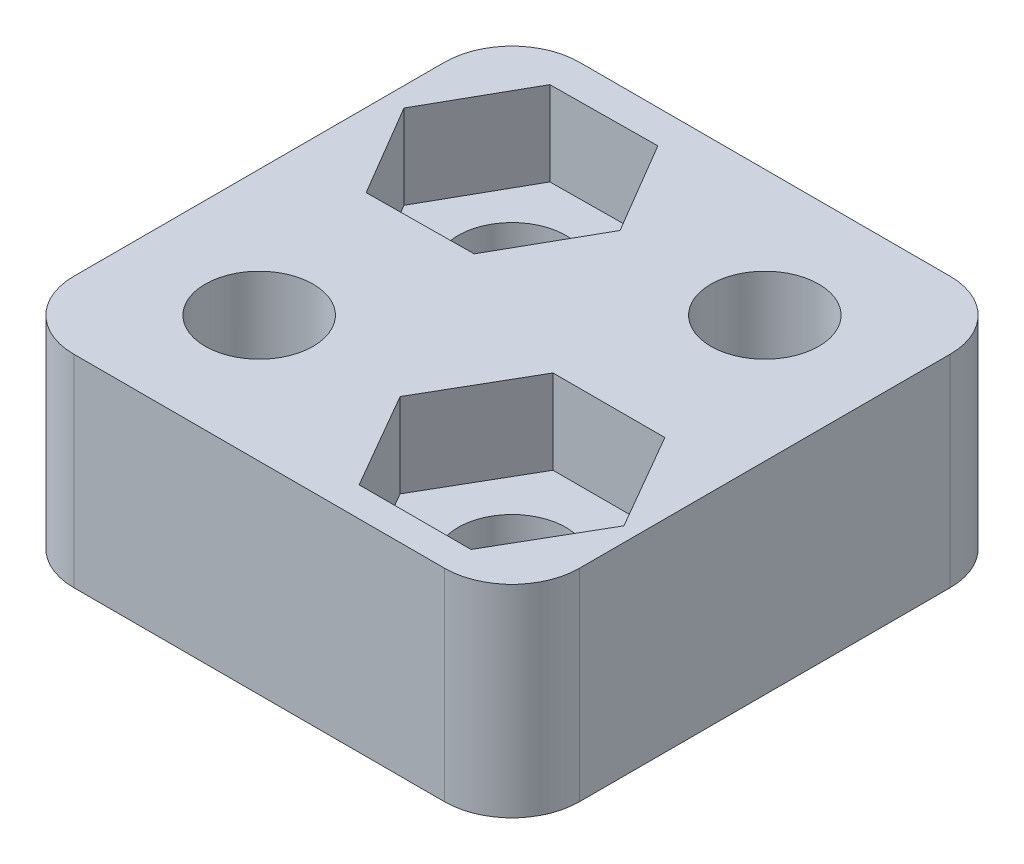
ISO-10303-21;
HEADER;
FILE_DESCRIPTION(('STEP AP214'),'2;1');
FILE_NAME('part.step','',(''),(''),'','','');
FILE_SCHEMA(('AUTOMOTIVE_DESIGN { 1 0 10303 214 1 1 1 1 }'));
ENDSEC;
DATA;
#1=APPLICATION_CONTEXT('core data for automotive mechanical design processes');
#2=APPLICATION_PROTOCOL_DEFINITION('international standard','automotive_design',2000,#1);
#3=PRODUCT_CONTEXT('',#1,'mechanical');
#4=PRODUCT('Part','Part','',(#3));
#5=PRODUCT_RELATED_PRODUCT_CATEGORY('part','',(#4));
#6=PRODUCT_DEFINITION_FORMATION('','',#4);
#7=PRODUCT_DEFINITION_CONTEXT('part definition',#1,'design');
#8=PRODUCT_DEFINITION('design','',#6,#7);
#9=PRODUCT_DEFINITION_SHAPE('','',#8);
#10=(LENGTH_UNIT() NAMED_UNIT(*) SI_UNIT(.MILLI.,.METRE.));
#11=(NAMED_UNIT(*) PLANE_ANGLE_UNIT() SI_UNIT($,.RADIAN.));
#12=(NAMED_UNIT(*) SI_UNIT($,.STERADIAN.) SOLID_ANGLE_UNIT());
#13=UNCERTAINTY_MEASURE_WITH_UNIT(LENGTH_MEASURE(1.E-05),#10,'distance_accuracy_value','');
#14=(GEOMETRIC_REPRESENTATION_CONTEXT(3) GLOBAL_UNCERTAINTY_ASSIGNED_CONTEXT((#13)) GLOBAL_UNIT_ASSIGNED_CONTEXT((#10,
#11,#12)) REPRESENTATION_CONTEXT('',''));
#15=CARTESIAN_POINT('',(0.,0.,0.));
#16=DIRECTION('',(0.,0.,1.));
#17=DIRECTION('',(1.,0.,0.));
#18=AXIS2_PLACEMENT_3D('',#15,#16,#17);
#19=CARTESIAN_POINT('',(3.77764647859923,6.,-4.95127844552152));
#20=DIRECTION('',(0.,-1.,0.));
#21=DIRECTION('',(0.,0.,-1.));
#22=AXIS2_PLACEMENT_3D('',#19,#20,#21);
#23=CYLINDRICAL_SURFACE('',#22,1.6);
#24=CARTESIAN_POINT('',(3.77764647859923,6.,-4.95127844552152));
#25=DIRECTION('',(0.,1.,0.));
#26=DIRECTION('',(0.,0.,1.));
#27=AXIS2_PLACEMENT_3D('',#24,#25,#26);
#28=CIRCLE('',#27,1.6);
#29=CARTESIAN_POINT('',(3.77764647859923,6.,-3.35127844552152));
#30=VERTEX_POINT('',#29);
#31=EDGE_CURVE('E291',#30,#30,#28,.T.);
#32=ORIENTED_EDGE('',*,*,#31,.T.);
#33=EDGE_LOOP('',(#32));
#34=FACE_BOUND('',#33,.T.);
#35=CARTESIAN_POINT('',(3.77764647859923,3.,-4.95127844552152));
#36=DIRECTION('',(0.,-1.,0.));
#37=DIRECTION('',(0.,0.,-1.));
#38=AXIS2_PLACEMENT_3D('',#35,#36,#37);
#39=CIRCLE('',#38,1.6);
#40=CARTESIAN_POINT('',(3.77764647859923,3.,-6.55127844552152));
#41=VERTEX_POINT('',#40);
#42=EDGE_CURVE('E254',#41,#41,#39,.T.);
#43=ORIENTED_EDGE('',*,*,#42,.T.);
#44=EDGE_LOOP('',(#43));
#45=FACE_BOUND('',#44,.T.);
#46=ADVANCED_FACE('F39',(#34,#45),#23,.F.);
#47=CARTESIAN_POINT('',(-3.72235352140077,6.,2.54872155447848));
#48=DIRECTION('',(0.,-1.,0.));
#49=DIRECTION('',(0.,0.,-1.));
#50=AXIS2_PLACEMENT_3D('',#47,#48,#49);
#51=CYLINDRICAL_SURFACE('',#50,1.6);
#52=CARTESIAN_POINT('',(-3.72235352140077,6.,2.54872155447848));
#53=DIRECTION('',(0.,1.,0.));
#54=DIRECTION('',(0.,0.,1.));
#55=AXIS2_PLACEMENT_3D('',#52,#53,#54);
#56=CIRCLE('',#55,1.6);
#57=CARTESIAN_POINT('',(-3.72235352140077,6.,4.14872155447848));
#58=VERTEX_POINT('',#57);
#59=EDGE_CURVE('E288',#58,#58,#56,.T.);
#60=ORIENTED_EDGE('',*,*,#59,.T.);
#61=EDGE_LOOP('',(#60));
#62=FACE_BOUND('',#61,.T.);
#63=CARTESIAN_POINT('',(-3.72235352140077,3.,2.54872155447848));
#64=DIRECTION('',(0.,-1.,0.));
#65=DIRECTION('',(0.,0.,-1.));
#66=AXIS2_PLACEMENT_3D('',#63,#64,#65);
#67=CIRCLE('',#66,1.6);
#68=CARTESIAN_POINT('',(-3.72235352140077,3.,0.948721554478482));
#69=VERTEX_POINT('',#68);
#70=EDGE_CURVE('E327',#69,#69,#67,.T.);
#71=ORIENTED_EDGE('',*,*,#70,.T.);
#72=EDGE_LOOP('',(#71));
#73=FACE_BOUND('',#72,.T.);
#74=ADVANCED_FACE('F406',(#62,#73),#51,.F.);
#75=CARTESIAN_POINT('',(-3.72235352140077,6.,-4.95127844552152));
#76=DIRECTION('',(0.,-1.,0.));
#77=DIRECTION('',(0.,0.,-1.));
#78=AXIS2_PLACEMENT_3D('',#75,#76,#77);
#79=CYLINDRICAL_SURFACE('',#78,1.6);
#80=CARTESIAN_POINT('',(-3.72235352140077,0.,-4.95127844552152));
#81=DIRECTION('',(0.,1.,0.));
#82=DIRECTION('',(0.,0.,1.));
#83=AXIS2_PLACEMENT_3D('',#80,#81,#82);
#84=CIRCLE('',#83,1.6);
#85=CARTESIAN_POINT('',(-3.72235352140077,0.,-3.35127844552152));
#86=VERTEX_POINT('',#85);
#87=EDGE_CURVE('E298',#86,#86,#84,.T.);
#88=ORIENTED_EDGE('',*,*,#87,.F.);
#89=EDGE_LOOP('',(#88));
#90=FACE_BOUND('',#89,.T.);
#91=CARTESIAN_POINT('',(-3.72235352140077,3.5,-4.95127844552152));
#92=DIRECTION('',(0.,1.,0.));
#93=DIRECTION('',(0.,0.,1.));
#94=AXIS2_PLACEMENT_3D('',#91,#92,#93);
#95=CIRCLE('',#94,1.6);
#96=CARTESIAN_POINT('',(-3.72235352140077,3.5,-3.35127844552152));
#97=VERTEX_POINT('',#96);
#98=EDGE_CURVE('E292',#97,#97,#95,.T.);
#99=ORIENTED_EDGE('',*,*,#98,.T.);
#100=EDGE_LOOP('',(#99));
#101=FACE_BOUND('',#100,.T.);
#102=ADVANCED_FACE('F413',(#90,#101),#79,.F.);
#103=CARTESIAN_POINT('',(3.77764647859923,6.,2.54872155447848));
#104=DIRECTION('',(0.,-1.,0.));
#105=DIRECTION('',(0.,0.,-1.));
#106=AXIS2_PLACEMENT_3D('',#103,#104,#105);
#107=CYLINDRICAL_SURFACE('',#106,1.6);
#108=CARTESIAN_POINT('',(3.77764647859923,0.,2.54872155447848));
#109=DIRECTION('',(0.,1.,0.));
#110=DIRECTION('',(0.,0.,1.));
#111=AXIS2_PLACEMENT_3D('',#108,#109,#110);
#112=CIRCLE('',#111,1.6);
#113=CARTESIAN_POINT('',(3.77764647859923,0.,4.14872155447848));
#114=VERTEX_POINT('',#113);
#115=EDGE_CURVE('E295',#114,#114,#112,.T.);
#116=ORIENTED_EDGE('',*,*,#115,.F.);
#117=EDGE_LOOP('',(#116));
#118=FACE_BOUND('',#117,.T.);
#119=CARTESIAN_POINT('',(3.77764647859923,3.5,2.54872155447848));
#120=DIRECTION('',(0.,1.,0.));
#121=DIRECTION('',(0.,0.,1.));
#122=AXIS2_PLACEMENT_3D('',#119,#120,#121);
#123=CIRCLE('',#122,1.6);
#124=CARTESIAN_POINT('',(3.77764647859923,3.5,4.14872155447848));
#125=VERTEX_POINT('',#124);
#126=EDGE_CURVE('E232',#125,#125,#123,.T.);
#127=ORIENTED_EDGE('',*,*,#126,.T.);
#128=EDGE_LOOP('',(#127));
#129=FACE_BOUND('',#128,.T.);
#130=ADVANCED_FACE('F419',(#118,#129),#107,.F.);
#131=CARTESIAN_POINT('',(0.,6.,0.));
#132=DIRECTION('',(0.,1.,0.));
#133=DIRECTION('',(0.,0.,1.));
#134=AXIS2_PLACEMENT_3D('',#131,#132,#133);
#135=PLANE('',#134);
#136=DIRECTION('',(0.999957198291809,0.,-0.00925211242877871));
#137=VECTOR('',#136,1.);
#138=CARTESIAN_POINT('',(-5.2845554956543,6.,-2.18670644881539));
#139=LINE('',#138,#137);
#140=CARTESIAN_POINT('',(-5.2845554956543,6.,-2.18670644881539));
#141=VERTEX_POINT('',#140);
#142=CARTESIAN_POINT('',(-2.10926492878896,6.,-2.21608585162269));
#143=VERTEX_POINT('',#142);
#144=EDGE_CURVE('E184',#141,#143,#139,.T.);
#145=ORIENTED_EDGE('',*,*,#144,.F.);
#146=DIRECTION('',(0.507991163547897,0.,0.861362280203431));
#147=VECTOR('',#146,1.);
#148=CARTESIAN_POINT('',(-6.89764408826611,6.,-4.92189904271421));
#149=LINE('',#148,#147);
#150=CARTESIAN_POINT('',(-6.89764408826611,6.,-4.92189904271421));
#151=VERTEX_POINT('',#150);
#152=EDGE_CURVE('E202',#151,#141,#149,.T.);
#153=ORIENTED_EDGE('',*,*,#152,.F.);
#154=DIRECTION('',(-0.491966034743913,0.,0.870614392632209));
#155=VECTOR('',#154,1.);
#156=CARTESIAN_POINT('',(-5.33544211401258,6.,-7.68647103942034));
#157=LINE('',#156,#155);
#158=CARTESIAN_POINT('',(-5.33544211401258,6.,-7.68647103942034));
#159=VERTEX_POINT('',#158);
#160=EDGE_CURVE('E205',#159,#151,#157,.T.);
#161=ORIENTED_EDGE('',*,*,#160,.F.);
#162=DIRECTION('',(-0.99995719829181,0.,0.00925211242877872));
#163=VECTOR('',#162,1.);
#164=CARTESIAN_POINT('',(-2.16015154714724,6.,-7.71585044222765));
#165=LINE('',#164,#163);
#166=CARTESIAN_POINT('',(-2.16015154714724,6.,-7.71585044222765));
#167=VERTEX_POINT('',#166);
#168=EDGE_CURVE('E225',#167,#159,#165,.T.);
#169=ORIENTED_EDGE('',*,*,#168,.F.);
#170=DIRECTION('',(-0.507991163547897,0.,-0.861362280203431));
#171=VECTOR('',#170,1.);
#172=CARTESIAN_POINT('',(-0.547062954535429,6.,-4.98065784832882));
#173=LINE('',#172,#171);
#174=CARTESIAN_POINT('',(-0.547062954535429,6.,-4.98065784832882));
#175=VERTEX_POINT('',#174);
#176=EDGE_CURVE('E222',#175,#167,#173,.T.);
#177=ORIENTED_EDGE('',*,*,#176,.F.);
#178=DIRECTION('',(0.491966034743913,0.,-0.87061439263221));
#179=VECTOR('',#178,1.);
#180=CARTESIAN_POINT('',(-2.10926492878896,6.,-2.21608585162269));
#181=LINE('',#180,#179);
#182=EDGE_CURVE('E219',#143,#175,#181,.T.);
#183=ORIENTED_EDGE('',*,*,#182,.F.);
#184=EDGE_LOOP('',(#145,#153,#161,#169,#177,#183));
#185=FACE_BOUND('',#184,.T.);
#186=DIRECTION('',(0.5,0.,-0.866025403784439));
#187=VECTOR('',#186,1.);
#188=CARTESIAN_POINT('',(5.4375285025194,6.,5.42372155447848));
#189=LINE('',#188,#187);
#190=CARTESIAN_POINT('',(5.4375285025194,6.,5.42372155447848));
#191=VERTEX_POINT('',#190);
#192=CARTESIAN_POINT('',(7.09741052643958,6.,2.54872155447848));
#193=VERTEX_POINT('',#192);
#194=EDGE_CURVE('E220',#191,#193,#189,.T.);
#195=ORIENTED_EDGE('',*,*,#194,.F.);
#196=DIRECTION('',(1.,0.,0.));
#197=VECTOR('',#196,1.);
#198=CARTESIAN_POINT('',(2.11776445467906,6.,5.42372155447848));
#199=LINE('',#198,#197);
#200=CARTESIAN_POINT('',(2.11776445467906,6.,5.42372155447848));
#201=VERTEX_POINT('',#200);
#202=EDGE_CURVE('E255',#201,#191,#199,.T.);
#203=ORIENTED_EDGE('',*,*,#202,.F.);
#204=DIRECTION('',(0.5,0.,0.866025403784439));
#205=VECTOR('',#204,1.);
#206=CARTESIAN_POINT('',(0.457882430758884,6.,2.54872155447848));
#207=LINE('',#206,#205);
#208=CARTESIAN_POINT('',(0.457882430758884,6.,2.54872155447848));
#209=VERTEX_POINT('',#208);
#210=EDGE_CURVE('E258',#209,#201,#207,.T.);
#211=ORIENTED_EDGE('',*,*,#210,.F.);
#212=DIRECTION('',(-0.5,0.,0.866025403784439));
#213=VECTOR('',#212,1.);
#214=CARTESIAN_POINT('',(2.11776445467906,6.,-0.326278445521518));
#215=LINE('',#214,#213);
#216=CARTESIAN_POINT('',(2.11776445467906,6.,-0.326278445521518));
#217=VERTEX_POINT('',#216);
#218=EDGE_CURVE('E262',#217,#209,#215,.T.);
#219=ORIENTED_EDGE('',*,*,#218,.F.);
#220=DIRECTION('',(-1.,0.,0.));
#221=VECTOR('',#220,1.);
#222=CARTESIAN_POINT('',(5.4375285025194,6.,-0.326278445521518));
#223=LINE('',#222,#221);
#224=CARTESIAN_POINT('',(5.4375285025194,6.,-0.326278445521518));
#225=VERTEX_POINT('',#224);
#226=EDGE_CURVE('E265',#225,#217,#223,.T.);
#227=ORIENTED_EDGE('',*,*,#226,.F.);
#228=DIRECTION('',(-0.5,0.,-0.866025403784438));
#229=VECTOR('',#228,1.);
#230=CARTESIAN_POINT('',(7.09741052643958,6.,2.54872155447848));
#231=LINE('',#230,#229);
#232=EDGE_CURVE('E268',#193,#225,#231,.T.);
#233=ORIENTED_EDGE('',*,*,#232,.F.);
#234=EDGE_LOOP('',(#195,#203,#211,#219,#227,#233));
#235=FACE_BOUND('',#234,.T.);
#236=ORIENTED_EDGE('',*,*,#31,.F.);
#237=EDGE_LOOP('',(#236));
#238=FACE_BOUND('',#237,.T.);
#239=DIRECTION('',(0.,0.,1.));
#240=VECTOR('',#239,1.);
#241=CARTESIAN_POINT('',(-7.47235352140077,6.,-8.70127844552152));
#242=LINE('',#241,#240);
#243=CARTESIAN_POINT('',(-7.47235352140077,6.,-6.70127844552152));
#244=VERTEX_POINT('',#243);
#245=CARTESIAN_POINT('',(-7.47235352140077,6.,4.29872155447848));
#246=VERTEX_POINT('',#245);
#247=EDGE_CURVE('E302',#244,#246,#242,.T.);
#248=ORIENTED_EDGE('',*,*,#247,.T.);
#249=CARTESIAN_POINT('',(-5.47235352140077,6.,4.29872155447848));
#250=DIRECTION('',(0.,1.,0.));
#251=DIRECTION('',(0.,0.,1.));
#252=AXIS2_PLACEMENT_3D('',#249,#250,#251);
#253=CIRCLE('',#252,2.);
#254=CARTESIAN_POINT('',(-5.47235352140077,6.,6.29872155447848));
#255=VERTEX_POINT('',#254);
#256=EDGE_CURVE('E355',#246,#255,#253,.T.);
#257=ORIENTED_EDGE('',*,*,#256,.T.);
#258=DIRECTION('',(1.,0.,0.));
#259=VECTOR('',#258,1.);
#260=CARTESIAN_POINT('',(-7.47235352140077,6.,6.29872155447848));
#261=LINE('',#260,#259);
#262=CARTESIAN_POINT('',(5.52764647859923,6.,6.29872155447848));
#263=VERTEX_POINT('',#262);
#264=EDGE_CURVE('E305',#255,#263,#261,.T.);
#265=ORIENTED_EDGE('',*,*,#264,.T.);
#266=CARTESIAN_POINT('',(5.52764647859923,6.,4.29872155447848));
#267=DIRECTION('',(0.,1.,0.));
#268=DIRECTION('',(0.,0.,1.));
#269=AXIS2_PLACEMENT_3D('',#266,#267,#268);
#270=CIRCLE('',#269,2.);
#271=CARTESIAN_POINT('',(7.52764647859923,6.,4.29872155447848));
#272=VERTEX_POINT('',#271);
#273=EDGE_CURVE('E353',#263,#272,#270,.T.);
#274=ORIENTED_EDGE('',*,*,#273,.T.);
#275=DIRECTION('',(0.,0.,-1.));
#276=VECTOR('',#275,1.);
#277=CARTESIAN_POINT('',(7.52764647859923,6.,6.29872155447848));
#278=LINE('',#277,#276);
#279=CARTESIAN_POINT('',(7.52764647859923,6.,-6.70127844552152));
#280=VERTEX_POINT('',#279);
#281=EDGE_CURVE('E309',#272,#280,#278,.T.);
#282=ORIENTED_EDGE('',*,*,#281,.T.);
#283=CARTESIAN_POINT('',(5.52764647859923,6.,-6.70127844552152));
#284=DIRECTION('',(0.,1.,0.));
#285=DIRECTION('',(0.,0.,1.));
#286=AXIS2_PLACEMENT_3D('',#283,#284,#285);
#287=CIRCLE('',#286,2.);
#288=CARTESIAN_POINT('',(5.52764647859923,6.,-8.70127844552152));
#289=VERTEX_POINT('',#288);
#290=EDGE_CURVE('E60',#280,#289,#287,.T.);
#291=ORIENTED_EDGE('',*,*,#290,.T.);
#292=DIRECTION('',(-1.,0.,0.));
#293=VECTOR('',#292,1.);
#294=CARTESIAN_POINT('',(7.52764647859923,6.,-8.70127844552152));
#295=LINE('',#294,#293);
#296=CARTESIAN_POINT('',(-5.47235352140077,6.,-8.70127844552152));
#297=VERTEX_POINT('',#296);
#298=EDGE_CURVE('E311',#289,#297,#295,.T.);
#299=ORIENTED_EDGE('',*,*,#298,.T.);
#300=CARTESIAN_POINT('',(-5.47235352140077,6.,-6.70127844552152));
#301=DIRECTION('',(0.,1.,0.));
#302=DIRECTION('',(0.,0.,1.));
#303=AXIS2_PLACEMENT_3D('',#300,#301,#302);
#304=CIRCLE('',#303,2.);
#305=EDGE_CURVE('E350',#297,#244,#304,.T.);
#306=ORIENTED_EDGE('',*,*,#305,.T.);
#307=EDGE_LOOP('',(#248,#257,#265,#274,#282,#291,#299,#306));
#308=FACE_BOUND('',#307,.T.);
#309=ORIENTED_EDGE('',*,*,#59,.F.);
#310=EDGE_LOOP('',(#309));
#311=FACE_BOUND('',#310,.T.);
#312=ADVANCED_FACE('F379',(#185,#235,#238,#308,#311),#135,.T.);
#313=CARTESIAN_POINT('',(0.,0.,0.));
#314=DIRECTION('',(0.,1.,0.));
#315=DIRECTION('',(0.,0.,1.));
#316=AXIS2_PLACEMENT_3D('',#313,#314,#315);
#317=PLANE('',#316);
#318=CARTESIAN_POINT('',(3.77764647859923,0.,-4.95127844552152));
#319=DIRECTION('',(0.,-1.,0.));
#320=DIRECTION('',(0.,0.,-1.));
#321=AXIS2_PLACEMENT_3D('',#318,#319,#320);
#322=CIRCLE('',#321,2.75);
#323=CARTESIAN_POINT('',(3.77764647859923,0.,-7.70127844552152));
#324=VERTEX_POINT('',#323);
#325=EDGE_CURVE('E728',#324,#324,#322,.T.);
#326=ORIENTED_EDGE('',*,*,#325,.F.);
#327=EDGE_LOOP('',(#326));
#328=FACE_BOUND('',#327,.T.);
#329=CARTESIAN_POINT('',(-3.72235352140077,0.,2.54872155447848));
#330=DIRECTION('',(0.,-1.,0.));
#331=DIRECTION('',(0.,0.,-1.));
#332=AXIS2_PLACEMENT_3D('',#329,#330,#331);
#333=CIRCLE('',#332,2.75);
#334=CARTESIAN_POINT('',(-3.72235352140077,0.,-0.201278445521517));
#335=VERTEX_POINT('',#334);
#336=EDGE_CURVE('E726',#335,#335,#333,.T.);
#337=ORIENTED_EDGE('',*,*,#336,.F.);
#338=EDGE_LOOP('',(#337));
#339=FACE_BOUND('',#338,.T.);
#340=DIRECTION('',(1.,0.,0.));
#341=VECTOR('',#340,1.);
#342=CARTESIAN_POINT('',(-7.47235352140077,0.,6.29872155447848));
#343=LINE('',#342,#341);
#344=CARTESIAN_POINT('',(-5.47235352140077,0.,6.29872155447848));
#345=VERTEX_POINT('',#344);
#346=CARTESIAN_POINT('',(5.52764647859923,0.,6.29872155447848));
#347=VERTEX_POINT('',#346);
#348=EDGE_CURVE('E316',#345,#347,#343,.T.);
#349=ORIENTED_EDGE('',*,*,#348,.F.);
#350=CARTESIAN_POINT('',(-5.47235352140077,0.,4.29872155447848));
#351=DIRECTION('',(0.,1.,0.));
#352=DIRECTION('',(0.,0.,1.));
#353=AXIS2_PLACEMENT_3D('',#350,#351,#352);
#354=CIRCLE('',#353,2.);
#355=CARTESIAN_POINT('',(-7.47235352140077,0.,4.29872155447848));
#356=VERTEX_POINT('',#355);
#357=EDGE_CURVE('E343',#345,#356,#354,.F.);
#358=ORIENTED_EDGE('',*,*,#357,.T.);
#359=DIRECTION('',(0.,0.,1.));
#360=VECTOR('',#359,1.);
#361=CARTESIAN_POINT('',(-7.47235352140077,0.,-4.87774903375681));
#362=LINE('',#361,#360);
#363=CARTESIAN_POINT('',(-7.47235352140077,0.,-6.70127844552152));
#364=VERTEX_POINT('',#363);
#365=EDGE_CURVE('E301',#364,#356,#362,.T.);
#366=ORIENTED_EDGE('',*,*,#365,.F.);
#367=CARTESIAN_POINT('',(-5.47235352140077,0.,-6.70127844552152));
#368=DIRECTION('',(0.,1.,0.));
#369=DIRECTION('',(0.,0.,1.));
#370=AXIS2_PLACEMENT_3D('',#367,#368,#369);
#371=CIRCLE('',#370,2.);
#372=CARTESIAN_POINT('',(-5.47235352140077,0.,-8.70127844552152));
#373=VERTEX_POINT('',#372);
#374=EDGE_CURVE('E337',#364,#373,#371,.F.);
#375=ORIENTED_EDGE('',*,*,#374,.T.);
#376=DIRECTION('',(-1.,0.,0.));
#377=VECTOR('',#376,1.);
#378=CARTESIAN_POINT('',(7.52764647859923,0.,-8.70127844552152));
#379=LINE('',#378,#377);
#380=CARTESIAN_POINT('',(5.52764647859923,0.,-8.70127844552152));
#381=VERTEX_POINT('',#380);
#382=EDGE_CURVE('E306',#381,#373,#379,.T.);
#383=ORIENTED_EDGE('',*,*,#382,.F.);
#384=CARTESIAN_POINT('',(5.52764647859923,0.,-6.70127844552152));
#385=DIRECTION('',(0.,1.,0.));
#386=DIRECTION('',(0.,0.,1.));
#387=AXIS2_PLACEMENT_3D('',#384,#385,#386);
#388=CIRCLE('',#387,2.);
#389=CARTESIAN_POINT('',(7.52764647859923,0.,-6.70127844552152));
#390=VERTEX_POINT('',#389);
#391=EDGE_CURVE('E339',#381,#390,#388,.F.);
#392=ORIENTED_EDGE('',*,*,#391,.T.);
#393=DIRECTION('',(0.,0.,-1.));
#394=VECTOR('',#393,1.);
#395=CARTESIAN_POINT('',(7.52764647859923,0.,6.29872155447848));
#396=LINE('',#395,#394);
#397=CARTESIAN_POINT('',(7.52764647859923,0.,4.29872155447848));
#398=VERTEX_POINT('',#397);
#399=EDGE_CURVE('E319',#398,#390,#396,.T.);
#400=ORIENTED_EDGE('',*,*,#399,.F.);
#401=CARTESIAN_POINT('',(5.52764647859923,0.,4.29872155447848));
#402=DIRECTION('',(0.,1.,0.));
#403=DIRECTION('',(0.,0.,1.));
#404=AXIS2_PLACEMENT_3D('',#401,#402,#403);
#405=CIRCLE('',#404,2.);
#406=EDGE_CURVE('E341',#398,#347,#405,.F.);
#407=ORIENTED_EDGE('',*,*,#406,.T.);
#408=EDGE_LOOP('',(#349,#358,#366,#375,#383,#392,#400,#407));
#409=FACE_BOUND('',#408,.T.);
#410=ORIENTED_EDGE('',*,*,#87,.T.);
#411=EDGE_LOOP('',(#410));
#412=FACE_BOUND('',#411,.T.);
#413=ORIENTED_EDGE('',*,*,#115,.T.);
#414=EDGE_LOOP('',(#413));
#415=FACE_BOUND('',#414,.T.);
#416=ADVANCED_FACE('F371',(#328,#339,#409,#412,#415),#317,.F.);
#417=CARTESIAN_POINT('',(-7.47235352140077,6.,-4.87774903375681));
#418=DIRECTION('',(1.,0.,0.));
#419=DIRECTION('',(0.,0.,-1.));
#420=AXIS2_PLACEMENT_3D('',#417,#418,#419);
#421=PLANE('',#420);
#422=ORIENTED_EDGE('',*,*,#365,.T.);
#423=DIRECTION('',(0.,-1.,0.));
#424=VECTOR('',#423,1.);
#425=CARTESIAN_POINT('',(-7.47235352140077,6.,4.29872155447848));
#426=LINE('',#425,#424);
#427=EDGE_CURVE('E348',#356,#246,#426,.F.);
#428=ORIENTED_EDGE('',*,*,#427,.T.);
#429=ORIENTED_EDGE('',*,*,#247,.F.);
#430=DIRECTION('',(0.,-1.,0.));
#431=VECTOR('',#430,1.);
#432=CARTESIAN_POINT('',(-7.47235352140077,6.,-6.70127844552152));
#433=LINE('',#432,#431);
#434=EDGE_CURVE('E345',#244,#364,#433,.T.);
#435=ORIENTED_EDGE('',*,*,#434,.T.);
#436=EDGE_LOOP('',(#422,#428,#429,#435));
#437=FACE_BOUND('',#436,.T.);
#438=ADVANCED_FACE('F386',(#437),#421,.F.);
#439=CARTESIAN_POINT('',(-7.47235352140077,6.,6.29872155447848));
#440=DIRECTION('',(0.,0.,-1.));
#441=DIRECTION('',(-1.,0.,0.));
#442=AXIS2_PLACEMENT_3D('',#439,#440,#441);
#443=PLANE('',#442);
#444=ORIENTED_EDGE('',*,*,#264,.F.);
#445=DIRECTION('',(0.,-1.,0.));
#446=VECTOR('',#445,1.);
#447=CARTESIAN_POINT('',(-5.47235352140077,6.,6.29872155447848));
#448=LINE('',#447,#446);
#449=EDGE_CURVE('E334',#255,#345,#448,.T.);
#450=ORIENTED_EDGE('',*,*,#449,.T.);
#451=ORIENTED_EDGE('',*,*,#348,.T.);
#452=DIRECTION('',(0.,-1.,0.));
#453=VECTOR('',#452,1.);
#454=CARTESIAN_POINT('',(5.52764647859923,6.,6.29872155447848));
#455=LINE('',#454,#453);
#456=EDGE_CURVE('E313',#347,#263,#455,.F.);
#457=ORIENTED_EDGE('',*,*,#456,.T.);
#458=EDGE_LOOP('',(#444,#450,#451,#457));
#459=FACE_BOUND('',#458,.T.);
#460=ADVANCED_FACE('F394',(#459),#443,.F.);
#461=CARTESIAN_POINT('',(7.52764647859923,6.,6.29872155447848));
#462=DIRECTION('',(-1.,0.,0.));
#463=DIRECTION('',(0.,0.,1.));
#464=AXIS2_PLACEMENT_3D('',#461,#462,#463);
#465=PLANE('',#464);
#466=ORIENTED_EDGE('',*,*,#281,.F.);
#467=DIRECTION('',(0.,-1.,0.));
#468=VECTOR('',#467,1.);
#469=CARTESIAN_POINT('',(7.52764647859923,6.,4.29872155447848));
#470=LINE('',#469,#468);
#471=EDGE_CURVE('E359',#272,#398,#470,.T.);
#472=ORIENTED_EDGE('',*,*,#471,.T.);
#473=ORIENTED_EDGE('',*,*,#399,.T.);
#474=DIRECTION('',(0.,-1.,0.));
#475=VECTOR('',#474,1.);
#476=CARTESIAN_POINT('',(7.52764647859923,6.,-6.70127844552152));
#477=LINE('',#476,#475);
#478=EDGE_CURVE('E357',#390,#280,#477,.F.);
#479=ORIENTED_EDGE('',*,*,#478,.T.);
#480=EDGE_LOOP('',(#466,#472,#473,#479));
#481=FACE_BOUND('',#480,.T.);
#482=ADVANCED_FACE('F365',(#481),#465,.F.);
#483=CARTESIAN_POINT('',(7.52764647859923,6.,-8.70127844552152));
#484=DIRECTION('',(0.,0.,1.));
#485=DIRECTION('',(1.,0.,0.));
#486=AXIS2_PLACEMENT_3D('',#483,#484,#485);
#487=PLANE('',#486);
#488=ORIENTED_EDGE('',*,*,#298,.F.);
#489=DIRECTION('',(0.,-1.,0.));
#490=VECTOR('',#489,1.);
#491=CARTESIAN_POINT('',(5.52764647859923,6.,-8.70127844552152));
#492=LINE('',#491,#490);
#493=EDGE_CURVE('E11',#289,#381,#492,.T.);
#494=ORIENTED_EDGE('',*,*,#493,.T.);
#495=ORIENTED_EDGE('',*,*,#382,.T.);
#496=DIRECTION('',(0.,-1.,0.));
#497=VECTOR('',#496,1.);
#498=CARTESIAN_POINT('',(-5.47235352140077,6.,-8.70127844552152));
#499=LINE('',#498,#497);
#500=EDGE_CURVE('E47',#373,#297,#499,.F.);
#501=ORIENTED_EDGE('',*,*,#500,.T.);
#502=EDGE_LOOP('',(#488,#494,#495,#501));
#503=FACE_BOUND('',#502,.T.);
#504=ADVANCED_FACE('F377',(#503),#487,.F.);
#505=CARTESIAN_POINT('',(5.4375285025194,3.5,5.42372155447848));
#506=DIRECTION('',(0.866025403784439,0.,0.5));
#507=DIRECTION('',(0.5,0.,-0.866025403784439));
#508=AXIS2_PLACEMENT_3D('',#505,#506,#507);
#509=PLANE('',#508);
#510=ORIENTED_EDGE('',*,*,#194,.T.);
#511=DIRECTION('',(0.,1.,0.));
#512=VECTOR('',#511,1.);
#513=CARTESIAN_POINT('',(7.09741052643958,3.5,2.54872155447848));
#514=LINE('',#513,#512);
#515=CARTESIAN_POINT('',(7.09741052643958,3.5,2.54872155447848));
#516=VERTEX_POINT('',#515);
#517=EDGE_CURVE('E240',#516,#193,#514,.T.);
#518=ORIENTED_EDGE('',*,*,#517,.F.);
#519=DIRECTION('',(0.5,0.,-0.866025403784439));
#520=VECTOR('',#519,1.);
#521=CARTESIAN_POINT('',(5.4375285025194,3.5,5.42372155447848));
#522=LINE('',#521,#520);
#523=CARTESIAN_POINT('',(5.4375285025194,3.5,5.42372155447848));
#524=VERTEX_POINT('',#523);
#525=EDGE_CURVE('E259',#524,#516,#522,.T.);
#526=ORIENTED_EDGE('',*,*,#525,.F.);
#527=DIRECTION('',(0.,1.,0.));
#528=VECTOR('',#527,1.);
#529=CARTESIAN_POINT('',(5.4375285025194,3.5,5.42372155447848));
#530=LINE('',#529,#528);
#531=EDGE_CURVE('E252',#524,#191,#530,.T.);
#532=ORIENTED_EDGE('',*,*,#531,.T.);
#533=EDGE_LOOP('',(#510,#518,#526,#532));
#534=FACE_BOUND('',#533,.T.);
#535=ADVANCED_FACE('F434',(#534),#509,.F.);
#536=CARTESIAN_POINT('',(2.11776445467906,3.5,5.42372155447848));
#537=DIRECTION('',(0.,0.,1.));
#538=DIRECTION('',(1.,0.,0.));
#539=AXIS2_PLACEMENT_3D('',#536,#537,#538);
#540=PLANE('',#539);
#541=ORIENTED_EDGE('',*,*,#202,.T.);
#542=ORIENTED_EDGE('',*,*,#531,.F.);
#543=DIRECTION('',(1.,0.,0.));
#544=VECTOR('',#543,1.);
#545=CARTESIAN_POINT('',(2.11776445467906,3.5,5.42372155447848));
#546=LINE('',#545,#544);
#547=CARTESIAN_POINT('',(2.11776445467906,3.5,5.42372155447848));
#548=VERTEX_POINT('',#547);
#549=EDGE_CURVE('E243',#548,#524,#546,.T.);
#550=ORIENTED_EDGE('',*,*,#549,.F.);
#551=DIRECTION('',(0.,1.,0.));
#552=VECTOR('',#551,1.);
#553=CARTESIAN_POINT('',(2.11776445467906,3.5,5.42372155447848));
#554=LINE('',#553,#552);
#555=EDGE_CURVE('E250',#548,#201,#554,.T.);
#556=ORIENTED_EDGE('',*,*,#555,.T.);
#557=EDGE_LOOP('',(#541,#542,#550,#556));
#558=FACE_BOUND('',#557,.T.);
#559=ADVANCED_FACE('F644',(#558),#540,.F.);
#560=CARTESIAN_POINT('',(0.457882430758884,3.5,2.54872155447848));
#561=DIRECTION('',(-0.866025403784439,0.,0.5));
#562=DIRECTION('',(0.5,0.,0.866025403784439));
#563=AXIS2_PLACEMENT_3D('',#560,#561,#562);
#564=PLANE('',#563);
#565=ORIENTED_EDGE('',*,*,#210,.T.);
#566=ORIENTED_EDGE('',*,*,#555,.F.);
#567=DIRECTION('',(0.5,0.,0.866025403784439));
#568=VECTOR('',#567,1.);
#569=CARTESIAN_POINT('',(0.457882430758884,3.5,2.54872155447848));
#570=LINE('',#569,#568);
#571=CARTESIAN_POINT('',(0.457882430758884,3.5,2.54872155447848));
#572=VERTEX_POINT('',#571);
#573=EDGE_CURVE('E274',#572,#548,#570,.T.);
#574=ORIENTED_EDGE('',*,*,#573,.F.);
#575=DIRECTION('',(0.,1.,0.));
#576=VECTOR('',#575,1.);
#577=CARTESIAN_POINT('',(0.457882430758884,3.5,2.54872155447848));
#578=LINE('',#577,#576);
#579=EDGE_CURVE('E248',#572,#209,#578,.T.);
#580=ORIENTED_EDGE('',*,*,#579,.T.);
#581=EDGE_LOOP('',(#565,#566,#574,#580));
#582=FACE_BOUND('',#581,.T.);
#583=ADVANCED_FACE('F634',(#582),#564,.F.);
#584=CARTESIAN_POINT('',(2.11776445467906,3.5,-0.326278445521518));
#585=DIRECTION('',(-0.866025403784439,0.,-0.5));
#586=DIRECTION('',(-0.5,0.,0.866025403784439));
#587=AXIS2_PLACEMENT_3D('',#584,#585,#586);
#588=PLANE('',#587);
#589=ORIENTED_EDGE('',*,*,#218,.T.);
#590=ORIENTED_EDGE('',*,*,#579,.F.);
#591=DIRECTION('',(-0.5,0.,0.866025403784439));
#592=VECTOR('',#591,1.);
#593=CARTESIAN_POINT('',(2.11776445467906,3.5,-0.326278445521518));
#594=LINE('',#593,#592);
#595=CARTESIAN_POINT('',(2.11776445467906,3.5,-0.326278445521518));
#596=VERTEX_POINT('',#595);
#597=EDGE_CURVE('E277',#596,#572,#594,.T.);
#598=ORIENTED_EDGE('',*,*,#597,.F.);
#599=DIRECTION('',(0.,1.,0.));
#600=VECTOR('',#599,1.);
#601=CARTESIAN_POINT('',(2.11776445467906,3.5,-0.326278445521518));
#602=LINE('',#601,#600);
#603=EDGE_CURVE('E246',#596,#217,#602,.T.);
#604=ORIENTED_EDGE('',*,*,#603,.T.);
#605=EDGE_LOOP('',(#589,#590,#598,#604));
#606=FACE_BOUND('',#605,.T.);
#607=ADVANCED_FACE('F624',(#606),#588,.F.);
#608=CARTESIAN_POINT('',(5.4375285025194,3.5,-0.326278445521518));
#609=DIRECTION('',(0.,0.,-1.));
#610=DIRECTION('',(-1.,0.,0.));
#611=AXIS2_PLACEMENT_3D('',#608,#609,#610);
#612=PLANE('',#611);
#613=ORIENTED_EDGE('',*,*,#226,.T.);
#614=ORIENTED_EDGE('',*,*,#603,.F.);
#615=DIRECTION('',(-1.,0.,0.));
#616=VECTOR('',#615,1.);
#617=CARTESIAN_POINT('',(5.4375285025194,3.5,-0.326278445521518));
#618=LINE('',#617,#616);
#619=CARTESIAN_POINT('',(5.4375285025194,3.5,-0.326278445521518));
#620=VERTEX_POINT('',#619);
#621=EDGE_CURVE('E280',#620,#596,#618,.T.);
#622=ORIENTED_EDGE('',*,*,#621,.F.);
#623=DIRECTION('',(0.,1.,0.));
#624=VECTOR('',#623,1.);
#625=CARTESIAN_POINT('',(5.4375285025194,3.5,-0.326278445521518));
#626=LINE('',#625,#624);
#627=EDGE_CURVE('E244',#620,#225,#626,.T.);
#628=ORIENTED_EDGE('',*,*,#627,.T.);
#629=EDGE_LOOP('',(#613,#614,#622,#628));
#630=FACE_BOUND('',#629,.T.);
#631=ADVANCED_FACE('F614',(#630),#612,.F.);
#632=CARTESIAN_POINT('',(7.09741052643958,3.5,2.54872155447848));
#633=DIRECTION('',(0.866025403784439,0.,-0.5));
#634=DIRECTION('',(-0.5,0.,-0.866025403784439));
#635=AXIS2_PLACEMENT_3D('',#632,#633,#634);
#636=PLANE('',#635);
#637=ORIENTED_EDGE('',*,*,#232,.T.);
#638=ORIENTED_EDGE('',*,*,#627,.F.);
#639=DIRECTION('',(-0.5,0.,-0.866025403784438));
#640=VECTOR('',#639,1.);
#641=CARTESIAN_POINT('',(7.09741052643958,3.5,2.54872155447848));
#642=LINE('',#641,#640);
#643=EDGE_CURVE('E283',#516,#620,#642,.T.);
#644=ORIENTED_EDGE('',*,*,#643,.F.);
#645=ORIENTED_EDGE('',*,*,#517,.T.);
#646=EDGE_LOOP('',(#637,#638,#644,#645));
#647=FACE_BOUND('',#646,.T.);
#648=ADVANCED_FACE('F605',(#647),#636,.F.);
#649=CARTESIAN_POINT('',(0.,3.5,0.));
#650=DIRECTION('',(0.,1.,0.));
#651=DIRECTION('',(0.,0.,1.));
#652=AXIS2_PLACEMENT_3D('',#649,#650,#651);
#653=PLANE('',#652);
#654=ORIENTED_EDGE('',*,*,#126,.F.);
#655=EDGE_LOOP('',(#654));
#656=FACE_BOUND('',#655,.T.);
#657=ORIENTED_EDGE('',*,*,#525,.T.);
#658=ORIENTED_EDGE('',*,*,#643,.T.);
#659=ORIENTED_EDGE('',*,*,#621,.T.);
#660=ORIENTED_EDGE('',*,*,#597,.T.);
#661=ORIENTED_EDGE('',*,*,#573,.T.);
#662=ORIENTED_EDGE('',*,*,#549,.T.);
#663=EDGE_LOOP('',(#657,#658,#659,#660,#661,#662));
#664=FACE_BOUND('',#663,.T.);
#665=ADVANCED_FACE('F596',(#656,#664),#653,.T.);
#666=CARTESIAN_POINT('',(-5.2845554956543,3.5,-2.18670644881539));
#667=DIRECTION('',(0.00925211242877871,0.,0.99995719829181));
#668=DIRECTION('',(0.99995719829181,0.,-0.00925211242877871));
#669=AXIS2_PLACEMENT_3D('',#666,#667,#668);
#670=PLANE('',#669);
#671=ORIENTED_EDGE('',*,*,#144,.T.);
#672=DIRECTION('',(0.,1.,0.));
#673=VECTOR('',#672,1.);
#674=CARTESIAN_POINT('',(-2.10926492878896,3.5,-2.21608585162269));
#675=LINE('',#674,#673);
#676=CARTESIAN_POINT('',(-2.10926492878896,3.5,-2.21608585162269));
#677=VERTEX_POINT('',#676);
#678=EDGE_CURVE('E177',#677,#143,#675,.T.);
#679=ORIENTED_EDGE('',*,*,#678,.F.);
#680=DIRECTION('',(0.999957198291809,0.,-0.00925211242877871));
#681=VECTOR('',#680,1.);
#682=CARTESIAN_POINT('',(-5.2845554956543,3.5,-2.18670644881539));
#683=LINE('',#682,#681);
#684=CARTESIAN_POINT('',(-5.2845554956543,3.5,-2.18670644881539));
#685=VERTEX_POINT('',#684);
#686=EDGE_CURVE('E181',#685,#677,#683,.T.);
#687=ORIENTED_EDGE('',*,*,#686,.F.);
#688=DIRECTION('',(0.,1.,0.));
#689=VECTOR('',#688,1.);
#690=CARTESIAN_POINT('',(-5.2845554956543,3.5,-2.18670644881539));
#691=LINE('',#690,#689);
#692=EDGE_CURVE('E230',#685,#141,#691,.T.);
#693=ORIENTED_EDGE('',*,*,#692,.T.);
#694=EDGE_LOOP('',(#671,#679,#687,#693));
#695=FACE_BOUND('',#694,.T.);
#696=ADVANCED_FACE('F179',(#695),#670,.F.);
#697=CARTESIAN_POINT('',(-6.89764408826611,3.5,-4.92189904271421));
#698=DIRECTION('',(-0.861362280203431,0.,0.507991163547897));
#699=DIRECTION('',(0.507991163547897,0.,0.861362280203431));
#700=AXIS2_PLACEMENT_3D('',#697,#698,#699);
#701=PLANE('',#700);
#702=ORIENTED_EDGE('',*,*,#152,.T.);
#703=ORIENTED_EDGE('',*,*,#692,.F.);
#704=DIRECTION('',(0.507991163547897,0.,0.861362280203431));
#705=VECTOR('',#704,1.);
#706=CARTESIAN_POINT('',(-6.89764408826611,3.5,-4.92189904271421));
#707=LINE('',#706,#705);
#708=CARTESIAN_POINT('',(-6.89764408826611,3.5,-4.92189904271421));
#709=VERTEX_POINT('',#708);
#710=EDGE_CURVE('E189',#709,#685,#707,.T.);
#711=ORIENTED_EDGE('',*,*,#710,.F.);
#712=DIRECTION('',(0.,1.,0.));
#713=VECTOR('',#712,1.);
#714=CARTESIAN_POINT('',(-6.89764408826611,3.5,-4.92189904271421));
#715=LINE('',#714,#713);
#716=EDGE_CURVE('E233',#709,#151,#715,.T.);
#717=ORIENTED_EDGE('',*,*,#716,.T.);
#718=EDGE_LOOP('',(#702,#703,#711,#717));
#719=FACE_BOUND('',#718,.T.);
#720=ADVANCED_FACE('F577',(#719),#701,.F.);
#721=CARTESIAN_POINT('',(-5.33544211401258,3.5,-7.68647103942034));
#722=DIRECTION('',(-0.87061439263221,0.,-0.491966034743913));
#723=DIRECTION('',(-0.491966034743913,0.,0.87061439263221));
#724=AXIS2_PLACEMENT_3D('',#721,#722,#723);
#725=PLANE('',#724);
#726=ORIENTED_EDGE('',*,*,#160,.T.);
#727=ORIENTED_EDGE('',*,*,#716,.F.);
#728=DIRECTION('',(-0.491966034743913,0.,0.870614392632209));
#729=VECTOR('',#728,1.);
#730=CARTESIAN_POINT('',(-5.33544211401258,3.5,-7.68647103942034));
#731=LINE('',#730,#729);
#732=CARTESIAN_POINT('',(-5.33544211401258,3.5,-7.68647103942034));
#733=VERTEX_POINT('',#732);
#734=EDGE_CURVE('E215',#733,#709,#731,.T.);
#735=ORIENTED_EDGE('',*,*,#734,.F.);
#736=DIRECTION('',(0.,1.,0.));
#737=VECTOR('',#736,1.);
#738=CARTESIAN_POINT('',(-5.33544211401258,3.5,-7.68647103942034));
#739=LINE('',#738,#737);
#740=EDGE_CURVE('E235',#733,#159,#739,.T.);
#741=ORIENTED_EDGE('',*,*,#740,.T.);
#742=EDGE_LOOP('',(#726,#727,#735,#741));
#743=FACE_BOUND('',#742,.T.);
#744=ADVANCED_FACE('F567',(#743),#725,.F.);
#745=CARTESIAN_POINT('',(-2.16015154714724,3.5,-7.71585044222765));
#746=DIRECTION('',(-0.00925211242877872,0.,-0.99995719829181));
#747=DIRECTION('',(-0.99995719829181,0.,0.00925211242877872));
#748=AXIS2_PLACEMENT_3D('',#745,#746,#747);
#749=PLANE('',#748);
#750=ORIENTED_EDGE('',*,*,#168,.T.);
#751=ORIENTED_EDGE('',*,*,#740,.F.);
#752=DIRECTION('',(-0.99995719829181,0.,0.00925211242877872));
#753=VECTOR('',#752,1.);
#754=CARTESIAN_POINT('',(-2.16015154714724,3.5,-7.71585044222765));
#755=LINE('',#754,#753);
#756=CARTESIAN_POINT('',(-2.16015154714724,3.5,-7.71585044222765));
#757=VERTEX_POINT('',#756);
#758=EDGE_CURVE('E212',#757,#733,#755,.T.);
#759=ORIENTED_EDGE('',*,*,#758,.F.);
#760=DIRECTION('',(0.,1.,0.));
#761=VECTOR('',#760,1.);
#762=CARTESIAN_POINT('',(-2.16015154714724,3.5,-7.71585044222765));
#763=LINE('',#762,#761);
#764=EDGE_CURVE('E237',#757,#167,#763,.T.);
#765=ORIENTED_EDGE('',*,*,#764,.T.);
#766=EDGE_LOOP('',(#750,#751,#759,#765));
#767=FACE_BOUND('',#766,.T.);
#768=ADVANCED_FACE('F557',(#767),#749,.F.);
#769=CARTESIAN_POINT('',(-0.547062954535429,3.5,-4.98065784832882));
#770=DIRECTION('',(0.861362280203431,0.,-0.507991163547897));
#771=DIRECTION('',(-0.507991163547897,0.,-0.861362280203431));
#772=AXIS2_PLACEMENT_3D('',#769,#770,#771);
#773=PLANE('',#772);
#774=ORIENTED_EDGE('',*,*,#176,.T.);
#775=ORIENTED_EDGE('',*,*,#764,.F.);
#776=DIRECTION('',(-0.507991163547897,0.,-0.861362280203431));
#777=VECTOR('',#776,1.);
#778=CARTESIAN_POINT('',(-0.547062954535429,3.5,-4.98065784832882));
#779=LINE('',#778,#777);
#780=CARTESIAN_POINT('',(-0.547062954535429,3.5,-4.98065784832882));
#781=VERTEX_POINT('',#780);
#782=EDGE_CURVE('E197',#781,#757,#779,.T.);
#783=ORIENTED_EDGE('',*,*,#782,.F.);
#784=DIRECTION('',(0.,1.,0.));
#785=VECTOR('',#784,1.);
#786=CARTESIAN_POINT('',(-0.547062954535429,3.5,-4.98065784832882));
#787=LINE('',#786,#785);
#788=EDGE_CURVE('E188',#781,#175,#787,.T.);
#789=ORIENTED_EDGE('',*,*,#788,.T.);
#790=EDGE_LOOP('',(#774,#775,#783,#789));
#791=FACE_BOUND('',#790,.T.);
#792=ADVANCED_FACE('F548',(#791),#773,.F.);
#793=CARTESIAN_POINT('',(-2.10926492878896,3.5,-2.21608585162269));
#794=DIRECTION('',(0.87061439263221,0.,0.491966034743913));
#795=DIRECTION('',(0.491966034743913,0.,-0.87061439263221));
#796=AXIS2_PLACEMENT_3D('',#793,#794,#795);
#797=PLANE('',#796);
#798=ORIENTED_EDGE('',*,*,#182,.T.);
#799=ORIENTED_EDGE('',*,*,#788,.F.);
#800=DIRECTION('',(0.491966034743913,0.,-0.87061439263221));
#801=VECTOR('',#800,1.);
#802=CARTESIAN_POINT('',(-2.10926492878896,3.5,-2.21608585162269));
#803=LINE('',#802,#801);
#804=EDGE_CURVE('E192',#677,#781,#803,.T.);
#805=ORIENTED_EDGE('',*,*,#804,.F.);
#806=ORIENTED_EDGE('',*,*,#678,.T.);
#807=EDGE_LOOP('',(#798,#799,#805,#806));
#808=FACE_BOUND('',#807,.T.);
#809=ADVANCED_FACE('F193',(#808),#797,.F.);
#810=CARTESIAN_POINT('',(0.,3.5,0.));
#811=DIRECTION('',(0.,1.,0.));
#812=DIRECTION('',(0.,0.,1.));
#813=AXIS2_PLACEMENT_3D('',#810,#811,#812);
#814=PLANE('',#813);
#815=ORIENTED_EDGE('',*,*,#98,.F.);
#816=EDGE_LOOP('',(#815));
#817=FACE_BOUND('',#816,.T.);
#818=ORIENTED_EDGE('',*,*,#686,.T.);
#819=ORIENTED_EDGE('',*,*,#804,.T.);
#820=ORIENTED_EDGE('',*,*,#782,.T.);
#821=ORIENTED_EDGE('',*,*,#758,.T.);
#822=ORIENTED_EDGE('',*,*,#734,.T.);
#823=ORIENTED_EDGE('',*,*,#710,.T.);
#824=EDGE_LOOP('',(#818,#819,#820,#821,#822,#823));
#825=FACE_BOUND('',#824,.T.);
#826=ADVANCED_FACE('F199',(#817,#825),#814,.T.);
#827=CARTESIAN_POINT('',(-3.72235352140077,3.,2.54872155447848));
#828=DIRECTION('',(0.,-1.,0.));
#829=DIRECTION('',(0.,0.,-1.));
#830=AXIS2_PLACEMENT_3D('',#827,#828,#829);
#831=CYLINDRICAL_SURFACE('',#830,2.75);
#832=CARTESIAN_POINT('',(-3.72235352140077,3.,2.54872155447848));
#833=DIRECTION('',(0.,-1.,0.));
#834=DIRECTION('',(0.,0.,-1.));
#835=AXIS2_PLACEMENT_3D('',#832,#833,#834);
#836=CIRCLE('',#835,2.75);
#837=CARTESIAN_POINT('',(-3.72235352140077,3.,-0.201278445521517));
#838=VERTEX_POINT('',#837);
#839=EDGE_CURVE('E208',#838,#838,#836,.T.);
#840=ORIENTED_EDGE('',*,*,#839,.F.);
#841=EDGE_LOOP('',(#840));
#842=FACE_BOUND('',#841,.T.);
#843=ORIENTED_EDGE('',*,*,#336,.T.);
#844=EDGE_LOOP('',(#843));
#845=FACE_BOUND('',#844,.T.);
#846=ADVANCED_FACE('F512',(#842,#845),#831,.F.);
#847=CARTESIAN_POINT('',(-3.72235352140077,3.,2.54872155447848));
#848=DIRECTION('',(0.,-1.,0.));
#849=DIRECTION('',(0.,0.,-1.));
#850=AXIS2_PLACEMENT_3D('',#847,#848,#849);
#851=PLANE('',#850);
#852=ORIENTED_EDGE('',*,*,#70,.F.);
#853=EDGE_LOOP('',(#852));
#854=FACE_BOUND('',#853,.T.);
#855=ORIENTED_EDGE('',*,*,#839,.T.);
#856=EDGE_LOOP('',(#855));
#857=FACE_BOUND('',#856,.T.);
#858=ADVANCED_FACE('F502',(#854,#857),#851,.T.);
#859=CARTESIAN_POINT('',(3.77764647859923,3.,-4.95127844552152));
#860=DIRECTION('',(0.,-1.,0.));
#861=DIRECTION('',(0.,0.,-1.));
#862=AXIS2_PLACEMENT_3D('',#859,#860,#861);
#863=CYLINDRICAL_SURFACE('',#862,2.75);
#864=CARTESIAN_POINT('',(3.77764647859923,3.,-4.95127844552152));
#865=DIRECTION('',(0.,-1.,0.));
#866=DIRECTION('',(0.,0.,-1.));
#867=AXIS2_PLACEMENT_3D('',#864,#865,#866);
#868=CIRCLE('',#867,2.75);
#869=CARTESIAN_POINT('',(3.77764647859923,3.,-7.70127844552152));
#870=VERTEX_POINT('',#869);
#871=EDGE_CURVE('E330',#870,#870,#868,.T.);
#872=ORIENTED_EDGE('',*,*,#871,.F.);
#873=EDGE_LOOP('',(#872));
#874=FACE_BOUND('',#873,.T.);
#875=ORIENTED_EDGE('',*,*,#325,.T.);
#876=EDGE_LOOP('',(#875));
#877=FACE_BOUND('',#876,.T.);
#878=ADVANCED_FACE('F492',(#874,#877),#863,.F.);
#879=CARTESIAN_POINT('',(3.77764647859923,3.,-4.95127844552152));
#880=DIRECTION('',(0.,-1.,0.));
#881=DIRECTION('',(0.,0.,-1.));
#882=AXIS2_PLACEMENT_3D('',#879,#880,#881);
#883=PLANE('',#882);
#884=ORIENTED_EDGE('',*,*,#42,.F.);
#885=EDGE_LOOP('',(#884));
#886=FACE_BOUND('',#885,.T.);
#887=ORIENTED_EDGE('',*,*,#871,.T.);
#888=EDGE_LOOP('',(#887));
#889=FACE_BOUND('',#888,.T.);
#890=ADVANCED_FACE('F403',(#886,#889),#883,.T.);
#891=CARTESIAN_POINT('',(-5.47235352140077,6.,4.29872155447848));
#892=DIRECTION('',(0.,-1.,0.));
#893=DIRECTION('',(0.,0.,-1.));
#894=AXIS2_PLACEMENT_3D('',#891,#892,#893);
#895=CYLINDRICAL_SURFACE('',#894,2.);
#896=ORIENTED_EDGE('',*,*,#256,.F.);
#897=ORIENTED_EDGE('',*,*,#427,.F.);
#898=ORIENTED_EDGE('',*,*,#357,.F.);
#899=ORIENTED_EDGE('',*,*,#449,.F.);
#900=EDGE_LOOP('',(#896,#897,#898,#899));
#901=FACE_BOUND('',#900,.T.);
#902=ADVANCED_FACE('F391',(#901),#895,.T.);
#903=CARTESIAN_POINT('',(5.52764647859923,6.,4.29872155447848));
#904=DIRECTION('',(0.,-1.,0.));
#905=DIRECTION('',(0.,0.,-1.));
#906=AXIS2_PLACEMENT_3D('',#903,#904,#905);
#907=CYLINDRICAL_SURFACE('',#906,2.);
#908=ORIENTED_EDGE('',*,*,#273,.F.);
#909=ORIENTED_EDGE('',*,*,#456,.F.);
#910=ORIENTED_EDGE('',*,*,#406,.F.);
#911=ORIENTED_EDGE('',*,*,#471,.F.);
#912=EDGE_LOOP('',(#908,#909,#910,#911));
#913=FACE_BOUND('',#912,.T.);
#914=ADVANCED_FACE('F396',(#913),#907,.T.);
#915=CARTESIAN_POINT('',(5.52764647859923,6.,-6.70127844552152));
#916=DIRECTION('',(0.,-1.,0.));
#917=DIRECTION('',(0.,0.,-1.));
#918=AXIS2_PLACEMENT_3D('',#915,#916,#917);
#919=CYLINDRICAL_SURFACE('',#918,2.);
#920=ORIENTED_EDGE('',*,*,#290,.F.);
#921=ORIENTED_EDGE('',*,*,#478,.F.);
#922=ORIENTED_EDGE('',*,*,#391,.F.);
#923=ORIENTED_EDGE('',*,*,#493,.F.);
#924=EDGE_LOOP('',(#920,#921,#922,#923));
#925=FACE_BOUND('',#924,.T.);
#926=ADVANCED_FACE('F376',(#925),#919,.T.);
#927=CARTESIAN_POINT('',(-5.47235352140077,6.,-6.70127844552152));
#928=DIRECTION('',(0.,-1.,0.));
#929=DIRECTION('',(0.,0.,-1.));
#930=AXIS2_PLACEMENT_3D('',#927,#928,#929);
#931=CYLINDRICAL_SURFACE('',#930,2.);
#932=ORIENTED_EDGE('',*,*,#305,.F.);
#933=ORIENTED_EDGE('',*,*,#500,.F.);
#934=ORIENTED_EDGE('',*,*,#374,.F.);
#935=ORIENTED_EDGE('',*,*,#434,.F.);
#936=EDGE_LOOP('',(#932,#933,#934,#935));
#937=FACE_BOUND('',#936,.T.);
#938=ADVANCED_FACE('F41',(#937),#931,.T.);
#939=CLOSED_SHELL('',(#46,#74,#102,#130,#312,#416,#438,#460,#482,#504,#535,#559,#583,#607,#631,
#648,#665,#696,#720,#744,#768,#792,#809,#826,#846,#858,#878,#890,#902,#914,#926,#938));
#940=MANIFOLD_SOLID_BREP('B2',#939);
#941=ADVANCED_BREP_SHAPE_REPRESENTATION('',(#18,#940),#14);
#942=SHAPE_DEFINITION_REPRESENTATION(#9,#941);
ENDSEC;
END-ISO-10303-21;
